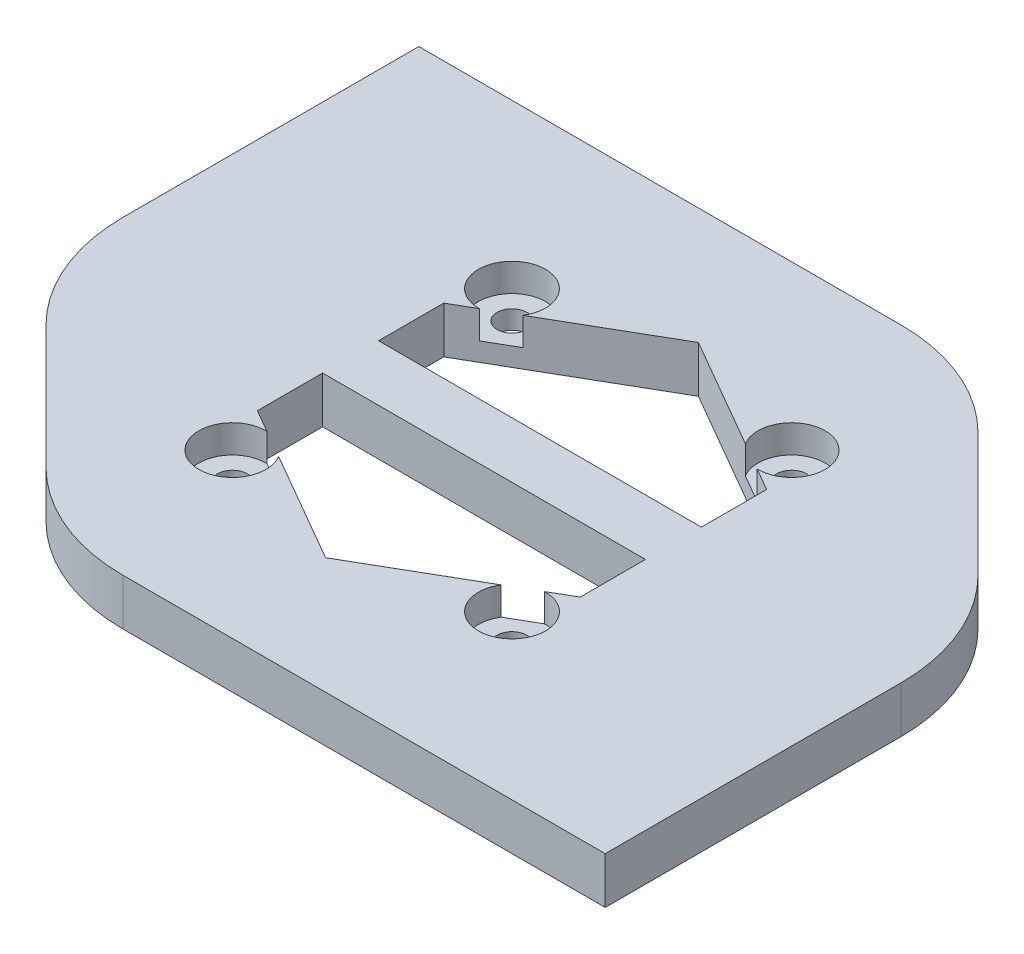
ISO-10303-21;
HEADER;
FILE_DESCRIPTION(('STEP AP214'),'2;1');
FILE_NAME('part.step','',(''),(''),'','','');
FILE_SCHEMA(('AUTOMOTIVE_DESIGN { 1 0 10303 214 1 1 1 1 }'));
ENDSEC;
DATA;
#1=APPLICATION_CONTEXT('core data for automotive mechanical design processes');
#2=APPLICATION_PROTOCOL_DEFINITION('international standard','automotive_design',2000,#1);
#3=PRODUCT_CONTEXT('',#1,'mechanical');
#4=PRODUCT('Part','Part','',(#3));
#5=PRODUCT_RELATED_PRODUCT_CATEGORY('part','',(#4));
#6=PRODUCT_DEFINITION_FORMATION('','',#4);
#7=PRODUCT_DEFINITION_CONTEXT('part definition',#1,'design');
#8=PRODUCT_DEFINITION('design','',#6,#7);
#9=PRODUCT_DEFINITION_SHAPE('','',#8);
#10=(LENGTH_UNIT() NAMED_UNIT(*) SI_UNIT(.MILLI.,.METRE.));
#11=(NAMED_UNIT(*) PLANE_ANGLE_UNIT() SI_UNIT($,.RADIAN.));
#12=(NAMED_UNIT(*) SI_UNIT($,.STERADIAN.) SOLID_ANGLE_UNIT());
#13=UNCERTAINTY_MEASURE_WITH_UNIT(LENGTH_MEASURE(1.E-05),#10,'distance_accuracy_value','');
#14=(GEOMETRIC_REPRESENTATION_CONTEXT(3) GLOBAL_UNCERTAINTY_ASSIGNED_CONTEXT((#13)) GLOBAL_UNIT_ASSIGNED_CONTEXT((#10,
#11,#12)) REPRESENTATION_CONTEXT('',''));
#15=CARTESIAN_POINT('',(0.,0.,0.));
#16=DIRECTION('',(0.,0.,1.));
#17=DIRECTION('',(1.,0.,0.));
#18=AXIS2_PLACEMENT_3D('',#15,#16,#17);
#19=CARTESIAN_POINT('',(42.5,5.,32.5));
#20=DIRECTION('',(-1.,0.,0.));
#21=DIRECTION('',(0.,0.,1.));
#22=AXIS2_PLACEMENT_3D('',#19,#20,#21);
#23=PLANE('',#22);
#24=DIRECTION('',(0.,0.,-1.));
#25=VECTOR('',#24,1.);
#26=CARTESIAN_POINT('',(42.5,0.,32.5));
#27=LINE('',#26,#25);
#28=CARTESIAN_POINT('',(42.5,0.,32.5));
#29=VERTEX_POINT('',#28);
#30=CARTESIAN_POINT('',(42.5,0.,0.784271247461894));
#31=VERTEX_POINT('',#30);
#32=EDGE_CURVE('E306',#29,#31,#27,.T.);
#33=ORIENTED_EDGE('',*,*,#32,.T.);
#34=DIRECTION('',(0.,1.,0.));
#35=VECTOR('',#34,1.);
#36=CARTESIAN_POINT('',(42.5,5.,0.784271247461894));
#37=LINE('',#36,#35);
#38=CARTESIAN_POINT('',(42.5,5.,0.784271247461894));
#39=VERTEX_POINT('',#38);
#40=EDGE_CURVE('E401',#31,#39,#37,.T.);
#41=ORIENTED_EDGE('',*,*,#40,.T.);
#42=DIRECTION('',(0.,0.,-1.));
#43=VECTOR('',#42,1.);
#44=CARTESIAN_POINT('',(42.5,5.,32.5));
#45=LINE('',#44,#43);
#46=CARTESIAN_POINT('',(42.5,5.,32.5));
#47=VERTEX_POINT('',#46);
#48=EDGE_CURVE('E294',#47,#39,#45,.T.);
#49=ORIENTED_EDGE('',*,*,#48,.F.);
#50=DIRECTION('',(0.,-1.,0.));
#51=VECTOR('',#50,1.);
#52=CARTESIAN_POINT('',(42.5,5.,32.5));
#53=LINE('',#52,#51);
#54=EDGE_CURVE('E305',#47,#29,#53,.T.);
#55=ORIENTED_EDGE('',*,*,#54,.T.);
#56=EDGE_LOOP('',(#33,#41,#49,#55));
#57=FACE_BOUND('',#56,.T.);
#58=ADVANCED_FACE('F37',(#57),#23,.F.);
#59=CARTESIAN_POINT('',(-42.5,5.,-32.5));
#60=DIRECTION('',(0.,0.,1.));
#61=DIRECTION('',(1.,0.,0.));
#62=AXIS2_PLACEMENT_3D('',#59,#60,#61);
#63=PLANE('',#62);
#64=DIRECTION('',(-1.,0.,0.));
#65=VECTOR('',#64,1.);
#66=CARTESIAN_POINT('',(-42.5,5.,-32.5));
#67=LINE('',#66,#65);
#68=CARTESIAN_POINT('',(9.21572875253809,5.,-32.5));
#69=VERTEX_POINT('',#68);
#70=CARTESIAN_POINT('',(-42.5,5.,-32.5));
#71=VERTEX_POINT('',#70);
#72=EDGE_CURVE('E297',#69,#71,#67,.T.);
#73=ORIENTED_EDGE('',*,*,#72,.F.);
#74=DIRECTION('',(0.,1.,0.));
#75=VECTOR('',#74,1.);
#76=CARTESIAN_POINT('',(9.21572875253809,0.,-32.5));
#77=LINE('',#76,#75);
#78=CARTESIAN_POINT('',(9.21572875253809,0.,-32.5));
#79=VERTEX_POINT('',#78);
#80=EDGE_CURVE('E11',#69,#79,#77,.F.);
#81=ORIENTED_EDGE('',*,*,#80,.T.);
#82=DIRECTION('',(-1.,0.,0.));
#83=VECTOR('',#82,1.);
#84=CARTESIAN_POINT('',(-42.5,0.,-32.5));
#85=LINE('',#84,#83);
#86=CARTESIAN_POINT('',(-42.5,0.,-32.5));
#87=VERTEX_POINT('',#86);
#88=EDGE_CURVE('E308',#79,#87,#85,.T.);
#89=ORIENTED_EDGE('',*,*,#88,.T.);
#90=DIRECTION('',(0.,-1.,0.));
#91=VECTOR('',#90,1.);
#92=CARTESIAN_POINT('',(-42.5,5.,-32.5));
#93=LINE('',#92,#91);
#94=EDGE_CURVE('E317',#71,#87,#93,.T.);
#95=ORIENTED_EDGE('',*,*,#94,.F.);
#96=EDGE_LOOP('',(#73,#81,#89,#95));
#97=FACE_BOUND('',#96,.T.);
#98=ADVANCED_FACE('F529',(#97),#63,.F.);
#99=CARTESIAN_POINT('',(0.,5.,0.));
#100=DIRECTION('',(0.,-1.,0.));
#101=DIRECTION('',(0.,0.,-1.));
#102=AXIS2_PLACEMENT_3D('',#99,#100,#101);
#103=PLANE('',#102);
#104=DIRECTION('',(0.866025403784439,0.,0.5));
#105=VECTOR('',#104,1.);
#106=CARTESIAN_POINT('',(-17.3205080756888,5.,10.));
#107=LINE('',#106,#105);
#108=CARTESIAN_POINT('',(-11.9372512876702,5.,13.1080247556794));
#109=VERTEX_POINT('',#108);
#110=CARTESIAN_POINT('',(0.,5.,20.));
#111=VERTEX_POINT('',#110);
#112=EDGE_CURVE('E259',#109,#111,#107,.T.);
#113=ORIENTED_EDGE('',*,*,#112,.F.);
#114=CARTESIAN_POINT('',(-15.,5.,15.));
#115=DIRECTION('',(0.,1.,0.));
#116=DIRECTION('',(0.,0.,1.));
#117=AXIS2_PLACEMENT_3D('',#114,#115,#116);
#118=CIRCLE('',#117,3.6);
#119=CARTESIAN_POINT('',(-14.892875731252,5.,11.401594187554));
#120=VERTEX_POINT('',#119);
#121=EDGE_CURVE('E450',#120,#109,#118,.T.);
#122=ORIENTED_EDGE('',*,*,#121,.F.);
#123=CARTESIAN_POINT('',(-17.3205080756888,5.,10.));
#124=VERTEX_POINT('',#123);
#125=EDGE_CURVE('E255',#124,#120,#107,.T.);
#126=ORIENTED_EDGE('',*,*,#125,.F.);
#127=DIRECTION('',(0.,0.,1.));
#128=VECTOR('',#127,1.);
#129=CARTESIAN_POINT('',(-17.3205080756888,5.,-10.));
#130=LINE('',#129,#128);
#131=CARTESIAN_POINT('',(-17.3205080756888,5.,3.));
#132=VERTEX_POINT('',#131);
#133=EDGE_CURVE('E272',#132,#124,#130,.T.);
#134=ORIENTED_EDGE('',*,*,#133,.F.);
#135=DIRECTION('',(1.,0.,0.));
#136=VECTOR('',#135,1.);
#137=CARTESIAN_POINT('',(-22.8414265511093,5.,3.));
#138=LINE('',#137,#136);
#139=CARTESIAN_POINT('',(17.3205080756888,5.,3.));
#140=VERTEX_POINT('',#139);
#141=EDGE_CURVE('E469',#132,#140,#138,.T.);
#142=ORIENTED_EDGE('',*,*,#141,.T.);
#143=DIRECTION('',(0.,0.,-1.));
#144=VECTOR('',#143,1.);
#145=CARTESIAN_POINT('',(17.3205080756888,5.,10.));
#146=LINE('',#145,#144);
#147=CARTESIAN_POINT('',(17.3205080756888,5.,10.));
#148=VERTEX_POINT('',#147);
#149=EDGE_CURVE('E253',#148,#140,#146,.T.);
#150=ORIENTED_EDGE('',*,*,#149,.F.);
#151=DIRECTION('',(0.866025403784439,0.,-0.5));
#152=VECTOR('',#151,1.);
#153=CARTESIAN_POINT('',(0.,5.,20.));
#154=LINE('',#153,#152);
#155=CARTESIAN_POINT('',(14.892875731252,5.,11.401594187554));
#156=VERTEX_POINT('',#155);
#157=EDGE_CURVE('E242',#156,#148,#154,.T.);
#158=ORIENTED_EDGE('',*,*,#157,.F.);
#159=CARTESIAN_POINT('',(15.,5.,15.));
#160=DIRECTION('',(0.,1.,0.));
#161=DIRECTION('',(0.,0.,1.));
#162=AXIS2_PLACEMENT_3D('',#159,#160,#161);
#163=CIRCLE('',#162,3.6);
#164=CARTESIAN_POINT('',(11.9372512876702,5.,13.1080247556794));
#165=VERTEX_POINT('',#164);
#166=EDGE_CURVE('E224',#165,#156,#163,.T.);
#167=ORIENTED_EDGE('',*,*,#166,.F.);
#168=EDGE_CURVE('E254',#111,#165,#154,.T.);
#169=ORIENTED_EDGE('',*,*,#168,.F.);
#170=EDGE_LOOP('',(#113,#122,#126,#134,#142,#150,#158,#167,#169));
#171=FACE_BOUND('',#170,.T.);
#172=DIRECTION('',(-0.866025403784439,0.,-0.5));
#173=VECTOR('',#172,1.);
#174=CARTESIAN_POINT('',(17.3205080756888,5.,-10.));
#175=LINE('',#174,#173);
#176=CARTESIAN_POINT('',(11.9372512876702,5.,-13.1080247556794));
#177=VERTEX_POINT('',#176);
#178=CARTESIAN_POINT('',(0.,5.,-20.));
#179=VERTEX_POINT('',#178);
#180=EDGE_CURVE('E264',#177,#179,#175,.T.);
#181=ORIENTED_EDGE('',*,*,#180,.F.);
#182=CARTESIAN_POINT('',(15.,5.,-15.));
#183=DIRECTION('',(0.,1.,0.));
#184=DIRECTION('',(0.,0.,1.));
#185=AXIS2_PLACEMENT_3D('',#182,#183,#184);
#186=CIRCLE('',#185,3.6);
#187=CARTESIAN_POINT('',(14.892875731252,5.,-11.401594187554));
#188=VERTEX_POINT('',#187);
#189=EDGE_CURVE('E445',#188,#177,#186,.T.);
#190=ORIENTED_EDGE('',*,*,#189,.F.);
#191=CARTESIAN_POINT('',(17.3205080756888,5.,-10.));
#192=VERTEX_POINT('',#191);
#193=EDGE_CURVE('E265',#192,#188,#175,.T.);
#194=ORIENTED_EDGE('',*,*,#193,.F.);
#195=CARTESIAN_POINT('',(17.3205080756888,5.,-3.));
#196=VERTEX_POINT('',#195);
#197=EDGE_CURVE('E257',#196,#192,#146,.T.);
#198=ORIENTED_EDGE('',*,*,#197,.F.);
#199=DIRECTION('',(-1.,0.,0.));
#200=VECTOR('',#199,1.);
#201=CARTESIAN_POINT('',(-22.8414265511093,5.,-3.));
#202=LINE('',#201,#200);
#203=CARTESIAN_POINT('',(-17.3205080756888,5.,-3.));
#204=VERTEX_POINT('',#203);
#205=EDGE_CURVE('E468',#196,#204,#202,.T.);
#206=ORIENTED_EDGE('',*,*,#205,.T.);
#207=CARTESIAN_POINT('',(-17.3205080756888,5.,-10.));
#208=VERTEX_POINT('',#207);
#209=EDGE_CURVE('E273',#208,#204,#130,.T.);
#210=ORIENTED_EDGE('',*,*,#209,.F.);
#211=DIRECTION('',(-0.866025403784439,0.,0.5));
#212=VECTOR('',#211,1.);
#213=CARTESIAN_POINT('',(0.,5.,-20.));
#214=LINE('',#213,#212);
#215=CARTESIAN_POINT('',(-14.892875731252,5.,-11.401594187554));
#216=VERTEX_POINT('',#215);
#217=EDGE_CURVE('E268',#216,#208,#214,.T.);
#218=ORIENTED_EDGE('',*,*,#217,.F.);
#219=CARTESIAN_POINT('',(-15.,5.,-15.));
#220=DIRECTION('',(0.,1.,0.));
#221=DIRECTION('',(0.,0.,1.));
#222=AXIS2_PLACEMENT_3D('',#219,#220,#221);
#223=CIRCLE('',#222,3.6);
#224=CARTESIAN_POINT('',(-11.9372512876702,5.,-13.1080247556794));
#225=VERTEX_POINT('',#224);
#226=EDGE_CURVE('E447',#225,#216,#223,.T.);
#227=ORIENTED_EDGE('',*,*,#226,.F.);
#228=EDGE_CURVE('E269',#179,#225,#214,.T.);
#229=ORIENTED_EDGE('',*,*,#228,.F.);
#230=EDGE_LOOP('',(#181,#190,#194,#198,#206,#210,#218,#227,#229));
#231=FACE_BOUND('',#230,.T.);
#232=DIRECTION('',(0.,0.,1.));
#233=VECTOR('',#232,1.);
#234=CARTESIAN_POINT('',(-42.5,5.,32.5));
#235=LINE('',#234,#233);
#236=CARTESIAN_POINT('',(-42.5,5.,-0.784271247461908));
#237=VERTEX_POINT('',#236);
#238=EDGE_CURVE('E300',#71,#237,#235,.T.);
#239=ORIENTED_EDGE('',*,*,#238,.T.);
#240=CARTESIAN_POINT('',(-22.5,5.,-0.784271247461908));
#241=DIRECTION('',(0.,-1.,0.));
#242=DIRECTION('',(0.,0.,-1.));
#243=AXIS2_PLACEMENT_3D('',#240,#241,#242);
#244=CIRCLE('',#243,20.);
#245=CARTESIAN_POINT('',(-36.642135623731,5.,13.357864376269));
#246=VERTEX_POINT('',#245);
#247=EDGE_CURVE('E386',#237,#246,#244,.F.);
#248=ORIENTED_EDGE('',*,*,#247,.T.);
#249=DIRECTION('',(0.707106781186548,0.,0.707106781186548));
#250=VECTOR('',#249,1.);
#251=CARTESIAN_POINT('',(-25.,5.,25.));
#252=LINE('',#251,#250);
#253=CARTESIAN_POINT('',(-23.357864376269,5.,26.642135623731));
#254=VERTEX_POINT('',#253);
#255=EDGE_CURVE('E420',#246,#254,#252,.T.);
#256=ORIENTED_EDGE('',*,*,#255,.T.);
#257=CARTESIAN_POINT('',(-9.2157287525381,5.,12.5));
#258=DIRECTION('',(0.,-1.,0.));
#259=DIRECTION('',(0.,0.,-1.));
#260=AXIS2_PLACEMENT_3D('',#257,#258,#259);
#261=CIRCLE('',#260,20.);
#262=CARTESIAN_POINT('',(-9.2157287525381,5.,32.5));
#263=VERTEX_POINT('',#262);
#264=EDGE_CURVE('E384',#254,#263,#261,.F.);
#265=ORIENTED_EDGE('',*,*,#264,.T.);
#266=DIRECTION('',(1.,0.,0.));
#267=VECTOR('',#266,1.);
#268=CARTESIAN_POINT('',(-42.5,5.,32.5));
#269=LINE('',#268,#267);
#270=EDGE_CURVE('E303',#263,#47,#269,.T.);
#271=ORIENTED_EDGE('',*,*,#270,.T.);
#272=ORIENTED_EDGE('',*,*,#48,.T.);
#273=CARTESIAN_POINT('',(22.5,5.,0.784271247461894));
#274=DIRECTION('',(0.,-1.,0.));
#275=DIRECTION('',(0.,0.,-1.));
#276=AXIS2_PLACEMENT_3D('',#273,#274,#275);
#277=CIRCLE('',#276,20.);
#278=CARTESIAN_POINT('',(36.642135623731,5.,-13.357864376269));
#279=VERTEX_POINT('',#278);
#280=EDGE_CURVE('E382',#39,#279,#277,.F.);
#281=ORIENTED_EDGE('',*,*,#280,.T.);
#282=DIRECTION('',(0.707106781186548,0.,0.707106781186548));
#283=VECTOR('',#282,1.);
#284=CARTESIAN_POINT('',(25.,5.,-25.));
#285=LINE('',#284,#283);
#286=CARTESIAN_POINT('',(23.357864376269,5.,-26.642135623731));
#287=VERTEX_POINT('',#286);
#288=EDGE_CURVE('E414',#287,#279,#285,.T.);
#289=ORIENTED_EDGE('',*,*,#288,.F.);
#290=CARTESIAN_POINT('',(9.21572875253809,5.,-12.5));
#291=DIRECTION('',(0.,-1.,0.));
#292=DIRECTION('',(0.,0.,-1.));
#293=AXIS2_PLACEMENT_3D('',#290,#291,#292);
#294=CIRCLE('',#293,20.);
#295=EDGE_CURVE('E380',#287,#69,#294,.F.);
#296=ORIENTED_EDGE('',*,*,#295,.T.);
#297=ORIENTED_EDGE('',*,*,#72,.T.);
#298=EDGE_LOOP('',(#239,#248,#256,#265,#271,#272,#281,#289,#296,#297));
#299=FACE_BOUND('',#298,.T.);
#300=ADVANCED_FACE('F249',(#171,#231,#299),#103,.F.);
#301=CARTESIAN_POINT('',(0.,0.,0.));
#302=DIRECTION('',(0.,-1.,0.));
#303=DIRECTION('',(0.,0.,-1.));
#304=AXIS2_PLACEMENT_3D('',#301,#302,#303);
#305=PLANE('',#304);
#306=DIRECTION('',(0.,0.,-1.));
#307=VECTOR('',#306,1.);
#308=CARTESIAN_POINT('',(-17.3205080756888,0.,0.));
#309=LINE('',#308,#307);
#310=CARTESIAN_POINT('',(-17.3205080756888,0.,-3.));
#311=VERTEX_POINT('',#310);
#312=CARTESIAN_POINT('',(-17.3205080756888,0.,-10.));
#313=VERTEX_POINT('',#312);
#314=EDGE_CURVE('E340',#311,#313,#309,.T.);
#315=ORIENTED_EDGE('',*,*,#314,.F.);
#316=DIRECTION('',(-1.,0.,0.));
#317=VECTOR('',#316,1.);
#318=CARTESIAN_POINT('',(-22.8414265511093,0.,-3.));
#319=LINE('',#318,#317);
#320=CARTESIAN_POINT('',(17.3205080756888,0.,-3.));
#321=VERTEX_POINT('',#320);
#322=EDGE_CURVE('E471',#321,#311,#319,.T.);
#323=ORIENTED_EDGE('',*,*,#322,.F.);
#324=DIRECTION('',(0.,0.,1.));
#325=VECTOR('',#324,1.);
#326=CARTESIAN_POINT('',(17.3205080756888,0.,0.));
#327=LINE('',#326,#325);
#328=CARTESIAN_POINT('',(17.3205080756888,0.,-10.));
#329=VERTEX_POINT('',#328);
#330=EDGE_CURVE('E333',#329,#321,#327,.T.);
#331=ORIENTED_EDGE('',*,*,#330,.F.);
#332=DIRECTION('',(0.866025403784439,0.,0.5));
#333=VECTOR('',#332,1.);
#334=CARTESIAN_POINT('',(8.66025403784439,0.,-15.));
#335=LINE('',#334,#333);
#336=CARTESIAN_POINT('',(0.,0.,-20.));
#337=VERTEX_POINT('',#336);
#338=EDGE_CURVE('E336',#337,#329,#335,.T.);
#339=ORIENTED_EDGE('',*,*,#338,.F.);
#340=DIRECTION('',(0.866025403784439,0.,-0.5));
#341=VECTOR('',#340,1.);
#342=CARTESIAN_POINT('',(-8.66025403784439,0.,-15.));
#343=LINE('',#342,#341);
#344=EDGE_CURVE('E338',#313,#337,#343,.T.);
#345=ORIENTED_EDGE('',*,*,#344,.F.);
#346=EDGE_LOOP('',(#315,#323,#331,#339,#345));
#347=FACE_BOUND('',#346,.T.);
#348=CARTESIAN_POINT('',(17.3205080756888,0.,3.));
#349=VERTEX_POINT('',#348);
#350=CARTESIAN_POINT('',(17.3205080756888,0.,10.));
#351=VERTEX_POINT('',#350);
#352=EDGE_CURVE('E332',#349,#351,#327,.T.);
#353=ORIENTED_EDGE('',*,*,#352,.F.);
#354=DIRECTION('',(1.,0.,0.));
#355=VECTOR('',#354,1.);
#356=CARTESIAN_POINT('',(-22.8414265511093,0.,3.));
#357=LINE('',#356,#355);
#358=CARTESIAN_POINT('',(-17.3205080756888,0.,3.));
#359=VERTEX_POINT('',#358);
#360=EDGE_CURVE('E475',#359,#349,#357,.T.);
#361=ORIENTED_EDGE('',*,*,#360,.F.);
#362=CARTESIAN_POINT('',(-17.3205080756888,0.,10.));
#363=VERTEX_POINT('',#362);
#364=EDGE_CURVE('E341',#363,#359,#309,.T.);
#365=ORIENTED_EDGE('',*,*,#364,.F.);
#366=DIRECTION('',(-0.866025403784439,0.,-0.5));
#367=VECTOR('',#366,1.);
#368=CARTESIAN_POINT('',(-8.66025403784439,0.,15.));
#369=LINE('',#368,#367);
#370=CARTESIAN_POINT('',(0.,0.,20.));
#371=VERTEX_POINT('',#370);
#372=EDGE_CURVE('E344',#371,#363,#369,.T.);
#373=ORIENTED_EDGE('',*,*,#372,.F.);
#374=DIRECTION('',(-0.866025403784439,0.,0.5));
#375=VECTOR('',#374,1.);
#376=CARTESIAN_POINT('',(8.66025403784439,0.,15.));
#377=LINE('',#376,#375);
#378=EDGE_CURVE('E320',#351,#371,#377,.T.);
#379=ORIENTED_EDGE('',*,*,#378,.F.);
#380=EDGE_LOOP('',(#353,#361,#365,#373,#379));
#381=FACE_BOUND('',#380,.T.);
#382=CARTESIAN_POINT('',(15.,0.,-15.));
#383=DIRECTION('',(0.,-1.,0.));
#384=DIRECTION('',(0.,0.,-1.));
#385=AXIS2_PLACEMENT_3D('',#382,#383,#384);
#386=CIRCLE('',#385,1.6);
#387=CARTESIAN_POINT('',(15.,0.,-16.6));
#388=VERTEX_POINT('',#387);
#389=EDGE_CURVE('E309',#388,#388,#386,.T.);
#390=ORIENTED_EDGE('',*,*,#389,.F.);
#391=EDGE_LOOP('',(#390));
#392=FACE_BOUND('',#391,.T.);
#393=CARTESIAN_POINT('',(-15.,0.,15.));
#394=DIRECTION('',(0.,-1.,0.));
#395=DIRECTION('',(0.,0.,-1.));
#396=AXIS2_PLACEMENT_3D('',#393,#394,#395);
#397=CIRCLE('',#396,1.6);
#398=CARTESIAN_POINT('',(-15.,0.,13.4));
#399=VERTEX_POINT('',#398);
#400=EDGE_CURVE('E326',#399,#399,#397,.T.);
#401=ORIENTED_EDGE('',*,*,#400,.F.);
#402=EDGE_LOOP('',(#401));
#403=FACE_BOUND('',#402,.T.);
#404=CARTESIAN_POINT('',(15.,0.,15.));
#405=DIRECTION('',(0.,-1.,0.));
#406=DIRECTION('',(0.,0.,-1.));
#407=AXIS2_PLACEMENT_3D('',#404,#405,#406);
#408=CIRCLE('',#407,1.6);
#409=CARTESIAN_POINT('',(15.,0.,13.4));
#410=VERTEX_POINT('',#409);
#411=EDGE_CURVE('E323',#410,#410,#408,.T.);
#412=ORIENTED_EDGE('',*,*,#411,.F.);
#413=EDGE_LOOP('',(#412));
#414=FACE_BOUND('',#413,.T.);
#415=CARTESIAN_POINT('',(-15.,0.,-15.));
#416=DIRECTION('',(0.,-1.,0.));
#417=DIRECTION('',(0.,0.,-1.));
#418=AXIS2_PLACEMENT_3D('',#415,#416,#417);
#419=CIRCLE('',#418,1.6);
#420=CARTESIAN_POINT('',(-15.,0.,-16.6));
#421=VERTEX_POINT('',#420);
#422=EDGE_CURVE('E280',#421,#421,#419,.T.);
#423=ORIENTED_EDGE('',*,*,#422,.F.);
#424=EDGE_LOOP('',(#423));
#425=FACE_BOUND('',#424,.T.);
#426=DIRECTION('',(-0.707106781186548,0.,-0.707106781186548));
#427=VECTOR('',#426,1.);
#428=CARTESIAN_POINT('',(-25.,0.,25.));
#429=LINE('',#428,#427);
#430=CARTESIAN_POINT('',(-23.357864376269,0.,26.642135623731));
#431=VERTEX_POINT('',#430);
#432=CARTESIAN_POINT('',(-36.642135623731,0.,13.357864376269));
#433=VERTEX_POINT('',#432);
#434=EDGE_CURVE('E421',#431,#433,#429,.T.);
#435=ORIENTED_EDGE('',*,*,#434,.T.);
#436=CARTESIAN_POINT('',(-22.5,0.,-0.784271247461908));
#437=DIRECTION('',(0.,-1.,0.));
#438=DIRECTION('',(0.,0.,-1.));
#439=AXIS2_PLACEMENT_3D('',#436,#437,#438);
#440=CIRCLE('',#439,20.);
#441=CARTESIAN_POINT('',(-42.5,0.,-0.784271247461908));
#442=VERTEX_POINT('',#441);
#443=EDGE_CURVE('E398',#433,#442,#440,.T.);
#444=ORIENTED_EDGE('',*,*,#443,.T.);
#445=DIRECTION('',(0.,0.,1.));
#446=VECTOR('',#445,1.);
#447=CARTESIAN_POINT('',(-42.5,0.,32.5));
#448=LINE('',#447,#446);
#449=EDGE_CURVE('E311',#87,#442,#448,.T.);
#450=ORIENTED_EDGE('',*,*,#449,.F.);
#451=ORIENTED_EDGE('',*,*,#88,.F.);
#452=CARTESIAN_POINT('',(9.21572875253809,0.,-12.5));
#453=DIRECTION('',(0.,-1.,0.));
#454=DIRECTION('',(0.,0.,-1.));
#455=AXIS2_PLACEMENT_3D('',#452,#453,#454);
#456=CIRCLE('',#455,20.);
#457=CARTESIAN_POINT('',(23.357864376269,0.,-26.642135623731));
#458=VERTEX_POINT('',#457);
#459=EDGE_CURVE('E393',#79,#458,#456,.T.);
#460=ORIENTED_EDGE('',*,*,#459,.T.);
#461=DIRECTION('',(-0.707106781186548,0.,-0.707106781186548));
#462=VECTOR('',#461,1.);
#463=CARTESIAN_POINT('',(25.,0.,-25.));
#464=LINE('',#463,#462);
#465=CARTESIAN_POINT('',(36.642135623731,0.,-13.357864376269));
#466=VERTEX_POINT('',#465);
#467=EDGE_CURVE('E411',#466,#458,#464,.T.);
#468=ORIENTED_EDGE('',*,*,#467,.F.);
#469=CARTESIAN_POINT('',(22.5,0.,0.784271247461894));
#470=DIRECTION('',(0.,-1.,0.));
#471=DIRECTION('',(0.,0.,-1.));
#472=AXIS2_PLACEMENT_3D('',#469,#470,#471);
#473=CIRCLE('',#472,20.);
#474=EDGE_CURVE('E60',#466,#31,#473,.T.);
#475=ORIENTED_EDGE('',*,*,#474,.T.);
#476=ORIENTED_EDGE('',*,*,#32,.F.);
#477=DIRECTION('',(1.,0.,0.));
#478=VECTOR('',#477,1.);
#479=CARTESIAN_POINT('',(-42.5,0.,32.5));
#480=LINE('',#479,#478);
#481=CARTESIAN_POINT('',(-9.2157287525381,0.,32.5));
#482=VERTEX_POINT('',#481);
#483=EDGE_CURVE('E298',#482,#29,#480,.T.);
#484=ORIENTED_EDGE('',*,*,#483,.F.);
#485=CARTESIAN_POINT('',(-9.2157287525381,0.,12.5));
#486=DIRECTION('',(0.,-1.,0.));
#487=DIRECTION('',(0.,0.,-1.));
#488=AXIS2_PLACEMENT_3D('',#485,#486,#487);
#489=CIRCLE('',#488,20.);
#490=EDGE_CURVE('E396',#482,#431,#489,.T.);
#491=ORIENTED_EDGE('',*,*,#490,.T.);
#492=EDGE_LOOP('',(#435,#444,#450,#451,#460,#468,#475,#476,#484,#491));
#493=FACE_BOUND('',#492,.T.);
#494=ADVANCED_FACE('F417',(#347,#381,#392,#403,#414,#425,#493),#305,.T.);
#495=CARTESIAN_POINT('',(-15.,-41.,-15.));
#496=DIRECTION('',(0.,1.,0.));
#497=DIRECTION('',(0.,0.,1.));
#498=AXIS2_PLACEMENT_3D('',#495,#496,#497);
#499=CYLINDRICAL_SURFACE('',#498,1.6);
#500=ORIENTED_EDGE('',*,*,#422,.T.);
#501=EDGE_LOOP('',(#500));
#502=FACE_BOUND('',#501,.T.);
#503=CARTESIAN_POINT('',(-15.,2.,-15.));
#504=DIRECTION('',(0.,1.,0.));
#505=DIRECTION('',(0.,0.,1.));
#506=AXIS2_PLACEMENT_3D('',#503,#504,#505);
#507=CIRCLE('',#506,1.6);
#508=CARTESIAN_POINT('',(-15.,2.,-13.4));
#509=VERTEX_POINT('',#508);
#510=EDGE_CURVE('E462',#509,#509,#507,.F.);
#511=ORIENTED_EDGE('',*,*,#510,.F.);
#512=EDGE_LOOP('',(#511));
#513=FACE_BOUND('',#512,.T.);
#514=ADVANCED_FACE('F524',(#502,#513),#499,.F.);
#515=CARTESIAN_POINT('',(15.,-41.,15.));
#516=DIRECTION('',(0.,1.,0.));
#517=DIRECTION('',(0.,0.,1.));
#518=AXIS2_PLACEMENT_3D('',#515,#516,#517);
#519=CYLINDRICAL_SURFACE('',#518,1.6);
#520=ORIENTED_EDGE('',*,*,#411,.T.);
#521=EDGE_LOOP('',(#520));
#522=FACE_BOUND('',#521,.T.);
#523=CARTESIAN_POINT('',(15.,2.,15.));
#524=DIRECTION('',(0.,1.,0.));
#525=DIRECTION('',(0.,0.,1.));
#526=AXIS2_PLACEMENT_3D('',#523,#524,#525);
#527=CIRCLE('',#526,1.6);
#528=CARTESIAN_POINT('',(15.,2.,16.6));
#529=VERTEX_POINT('',#528);
#530=EDGE_CURVE('E455',#529,#529,#527,.F.);
#531=ORIENTED_EDGE('',*,*,#530,.F.);
#532=EDGE_LOOP('',(#531));
#533=FACE_BOUND('',#532,.T.);
#534=ADVANCED_FACE('F514',(#522,#533),#519,.F.);
#535=CARTESIAN_POINT('',(-15.,-41.,15.));
#536=DIRECTION('',(0.,1.,0.));
#537=DIRECTION('',(0.,0.,1.));
#538=AXIS2_PLACEMENT_3D('',#535,#536,#537);
#539=CYLINDRICAL_SURFACE('',#538,1.6);
#540=ORIENTED_EDGE('',*,*,#400,.T.);
#541=EDGE_LOOP('',(#540));
#542=FACE_BOUND('',#541,.T.);
#543=CARTESIAN_POINT('',(-15.,2.,15.));
#544=DIRECTION('',(0.,1.,0.));
#545=DIRECTION('',(0.,0.,1.));
#546=AXIS2_PLACEMENT_3D('',#543,#544,#545);
#547=CIRCLE('',#546,1.6);
#548=CARTESIAN_POINT('',(-15.,2.,16.6));
#549=VERTEX_POINT('',#548);
#550=EDGE_CURVE('E465',#549,#549,#547,.F.);
#551=ORIENTED_EDGE('',*,*,#550,.F.);
#552=EDGE_LOOP('',(#551));
#553=FACE_BOUND('',#552,.T.);
#554=ADVANCED_FACE('F511',(#542,#553),#539,.F.);
#555=CARTESIAN_POINT('',(15.,-41.,-15.));
#556=DIRECTION('',(0.,1.,0.));
#557=DIRECTION('',(0.,0.,1.));
#558=AXIS2_PLACEMENT_3D('',#555,#556,#557);
#559=CYLINDRICAL_SURFACE('',#558,1.6);
#560=ORIENTED_EDGE('',*,*,#389,.T.);
#561=EDGE_LOOP('',(#560));
#562=FACE_BOUND('',#561,.T.);
#563=CARTESIAN_POINT('',(15.,2.,-15.));
#564=DIRECTION('',(0.,1.,0.));
#565=DIRECTION('',(0.,0.,1.));
#566=AXIS2_PLACEMENT_3D('',#563,#564,#565);
#567=CIRCLE('',#566,1.6);
#568=CARTESIAN_POINT('',(15.,2.,-13.4));
#569=VERTEX_POINT('',#568);
#570=EDGE_CURVE('E459',#569,#569,#567,.F.);
#571=ORIENTED_EDGE('',*,*,#570,.F.);
#572=EDGE_LOOP('',(#571));
#573=FACE_BOUND('',#572,.T.);
#574=ADVANCED_FACE('F513',(#562,#573),#559,.F.);
#575=CARTESIAN_POINT('',(-17.3205080756888,-41.,-10.));
#576=DIRECTION('',(-1.,0.,0.));
#577=DIRECTION('',(0.,0.,1.));
#578=AXIS2_PLACEMENT_3D('',#575,#576,#577);
#579=PLANE('',#578);
#580=ORIENTED_EDGE('',*,*,#209,.T.);
#581=DIRECTION('',(0.,-1.,0.));
#582=VECTOR('',#581,1.);
#583=CARTESIAN_POINT('',(-17.3205080756888,-41.,-3.));
#584=LINE('',#583,#582);
#585=EDGE_CURVE('E479',#204,#311,#584,.T.);
#586=ORIENTED_EDGE('',*,*,#585,.T.);
#587=ORIENTED_EDGE('',*,*,#314,.T.);
#588=DIRECTION('',(0.,1.,0.));
#589=VECTOR('',#588,1.);
#590=CARTESIAN_POINT('',(-17.3205080756888,-41.,-10.));
#591=LINE('',#590,#589);
#592=EDGE_CURVE('E281',#313,#208,#591,.T.);
#593=ORIENTED_EDGE('',*,*,#592,.T.);
#594=EDGE_LOOP('',(#580,#586,#587,#593));
#595=FACE_BOUND('',#594,.T.);
#596=ADVANCED_FACE('F521',(#595),#579,.F.);
#597=CARTESIAN_POINT('',(17.3205080756888,-41.,10.));
#598=DIRECTION('',(1.,0.,0.));
#599=DIRECTION('',(0.,0.,-1.));
#600=AXIS2_PLACEMENT_3D('',#597,#598,#599);
#601=PLANE('',#600);
#602=ORIENTED_EDGE('',*,*,#330,.T.);
#603=DIRECTION('',(0.,1.,0.));
#604=VECTOR('',#603,1.);
#605=CARTESIAN_POINT('',(17.3205080756888,-41.,-3.));
#606=LINE('',#605,#604);
#607=EDGE_CURVE('E349',#321,#196,#606,.T.);
#608=ORIENTED_EDGE('',*,*,#607,.T.);
#609=ORIENTED_EDGE('',*,*,#197,.T.);
#610=DIRECTION('',(0.,1.,0.));
#611=VECTOR('',#610,1.);
#612=CARTESIAN_POINT('',(17.3205080756888,-41.,-10.));
#613=LINE('',#612,#611);
#614=EDGE_CURVE('E287',#329,#192,#613,.T.);
#615=ORIENTED_EDGE('',*,*,#614,.F.);
#616=EDGE_LOOP('',(#602,#608,#609,#615));
#617=FACE_BOUND('',#616,.T.);
#618=ADVANCED_FACE('F560',(#617),#601,.F.);
#619=CARTESIAN_POINT('',(-42.5,5.,32.5));
#620=DIRECTION('',(1.,0.,0.));
#621=DIRECTION('',(0.,0.,-1.));
#622=AXIS2_PLACEMENT_3D('',#619,#620,#621);
#623=PLANE('',#622);
#624=ORIENTED_EDGE('',*,*,#449,.T.);
#625=DIRECTION('',(0.,1.,0.));
#626=VECTOR('',#625,1.);
#627=CARTESIAN_POINT('',(-42.5,5.,-0.784271247461908));
#628=LINE('',#627,#626);
#629=EDGE_CURVE('E377',#442,#237,#628,.T.);
#630=ORIENTED_EDGE('',*,*,#629,.T.);
#631=ORIENTED_EDGE('',*,*,#238,.F.);
#632=ORIENTED_EDGE('',*,*,#94,.T.);
#633=EDGE_LOOP('',(#624,#630,#631,#632));
#634=FACE_BOUND('',#633,.T.);
#635=ADVANCED_FACE('F556',(#634),#623,.F.);
#636=CARTESIAN_POINT('',(-42.5,5.,32.5));
#637=DIRECTION('',(0.,0.,-1.));
#638=DIRECTION('',(-1.,0.,0.));
#639=AXIS2_PLACEMENT_3D('',#636,#637,#638);
#640=PLANE('',#639);
#641=ORIENTED_EDGE('',*,*,#270,.F.);
#642=DIRECTION('',(0.,1.,0.));
#643=VECTOR('',#642,1.);
#644=CARTESIAN_POINT('',(-9.2157287525381,5.,32.5));
#645=LINE('',#644,#643);
#646=EDGE_CURVE('E52',#263,#482,#645,.F.);
#647=ORIENTED_EDGE('',*,*,#646,.T.);
#648=ORIENTED_EDGE('',*,*,#483,.T.);
#649=ORIENTED_EDGE('',*,*,#54,.F.);
#650=EDGE_LOOP('',(#641,#647,#648,#649));
#651=FACE_BOUND('',#650,.T.);
#652=ADVANCED_FACE('F430',(#651),#640,.F.);
#653=CARTESIAN_POINT('',(-17.3205080756888,-41.,10.));
#654=DIRECTION('',(-0.5,0.,0.866025403784439));
#655=DIRECTION('',(0.866025403784439,0.,0.5));
#656=AXIS2_PLACEMENT_3D('',#653,#654,#655);
#657=PLANE('',#656);
#658=DIRECTION('',(-0.866025403784439,0.,-0.5));
#659=VECTOR('',#658,1.);
#660=CARTESIAN_POINT('',(-17.3205080756888,2.,10.));
#661=LINE('',#660,#659);
#662=CARTESIAN_POINT('',(-11.9372512876702,2.,13.1080247556794));
#663=VERTEX_POINT('',#662);
#664=CARTESIAN_POINT('',(-14.892875731252,2.,11.401594187554));
#665=VERTEX_POINT('',#664);
#666=EDGE_CURVE('E369',#663,#665,#661,.T.);
#667=ORIENTED_EDGE('',*,*,#666,.F.);
#668=DIRECTION('',(0.,1.,0.));
#669=VECTOR('',#668,1.);
#670=CARTESIAN_POINT('',(-11.9372512876702,2.,13.1080247556794));
#671=LINE('',#670,#669);
#672=EDGE_CURVE('E374',#663,#109,#671,.T.);
#673=ORIENTED_EDGE('',*,*,#672,.T.);
#674=ORIENTED_EDGE('',*,*,#112,.T.);
#675=DIRECTION('',(0.,1.,0.));
#676=VECTOR('',#675,1.);
#677=CARTESIAN_POINT('',(0.,-41.,20.));
#678=LINE('',#677,#676);
#679=EDGE_CURVE('E276',#371,#111,#678,.T.);
#680=ORIENTED_EDGE('',*,*,#679,.F.);
#681=ORIENTED_EDGE('',*,*,#372,.T.);
#682=DIRECTION('',(0.,1.,0.));
#683=VECTOR('',#682,1.);
#684=CARTESIAN_POINT('',(-17.3205080756888,-41.,10.));
#685=LINE('',#684,#683);
#686=EDGE_CURVE('E277',#363,#124,#685,.T.);
#687=ORIENTED_EDGE('',*,*,#686,.T.);
#688=ORIENTED_EDGE('',*,*,#125,.T.);
#689=DIRECTION('',(0.,1.,0.));
#690=VECTOR('',#689,1.);
#691=CARTESIAN_POINT('',(-14.892875731252,2.,11.401594187554));
#692=LINE('',#691,#690);
#693=EDGE_CURVE('E371',#120,#665,#692,.F.);
#694=ORIENTED_EDGE('',*,*,#693,.T.);
#695=EDGE_LOOP('',(#667,#673,#674,#680,#681,#687,#688,#694));
#696=FACE_BOUND('',#695,.T.);
#697=ADVANCED_FACE('F486',(#696),#657,.F.);
#698=ORIENTED_EDGE('',*,*,#364,.T.);
#699=DIRECTION('',(0.,1.,0.));
#700=VECTOR('',#699,1.);
#701=CARTESIAN_POINT('',(-17.3205080756888,-41.,3.));
#702=LINE('',#701,#700);
#703=EDGE_CURVE('E477',#359,#132,#702,.T.);
#704=ORIENTED_EDGE('',*,*,#703,.T.);
#705=ORIENTED_EDGE('',*,*,#133,.T.);
#706=ORIENTED_EDGE('',*,*,#686,.F.);
#707=EDGE_LOOP('',(#698,#704,#705,#706));
#708=FACE_BOUND('',#707,.T.);
#709=ADVANCED_FACE('F499',(#708),#579,.F.);
#710=CARTESIAN_POINT('',(0.,-41.,-20.));
#711=DIRECTION('',(-0.5,0.,-0.866025403784439));
#712=DIRECTION('',(-0.866025403784439,0.,0.5));
#713=AXIS2_PLACEMENT_3D('',#710,#711,#712);
#714=PLANE('',#713);
#715=DIRECTION('',(0.866025403784439,0.,-0.5));
#716=VECTOR('',#715,1.);
#717=CARTESIAN_POINT('',(0.,2.,-20.));
#718=LINE('',#717,#716);
#719=CARTESIAN_POINT('',(-14.892875731252,2.,-11.401594187554));
#720=VERTEX_POINT('',#719);
#721=CARTESIAN_POINT('',(-11.9372512876702,2.,-13.1080247556794));
#722=VERTEX_POINT('',#721);
#723=EDGE_CURVE('E361',#720,#722,#718,.T.);
#724=ORIENTED_EDGE('',*,*,#723,.F.);
#725=DIRECTION('',(0.,1.,0.));
#726=VECTOR('',#725,1.);
#727=CARTESIAN_POINT('',(-14.892875731252,2.,-11.401594187554));
#728=LINE('',#727,#726);
#729=EDGE_CURVE('E366',#720,#216,#728,.T.);
#730=ORIENTED_EDGE('',*,*,#729,.T.);
#731=ORIENTED_EDGE('',*,*,#217,.T.);
#732=ORIENTED_EDGE('',*,*,#592,.F.);
#733=ORIENTED_EDGE('',*,*,#344,.T.);
#734=DIRECTION('',(0.,1.,0.));
#735=VECTOR('',#734,1.);
#736=CARTESIAN_POINT('',(0.,-41.,-20.));
#737=LINE('',#736,#735);
#738=EDGE_CURVE('E284',#337,#179,#737,.T.);
#739=ORIENTED_EDGE('',*,*,#738,.T.);
#740=ORIENTED_EDGE('',*,*,#228,.T.);
#741=DIRECTION('',(0.,1.,0.));
#742=VECTOR('',#741,1.);
#743=CARTESIAN_POINT('',(-11.9372512876702,2.,-13.1080247556794));
#744=LINE('',#743,#742);
#745=EDGE_CURVE('E363',#225,#722,#744,.F.);
#746=ORIENTED_EDGE('',*,*,#745,.T.);
#747=EDGE_LOOP('',(#724,#730,#731,#732,#733,#739,#740,#746));
#748=FACE_BOUND('',#747,.T.);
#749=ADVANCED_FACE('F606',(#748),#714,.F.);
#750=CARTESIAN_POINT('',(17.3205080756888,-41.,-10.));
#751=DIRECTION('',(0.5,0.,-0.866025403784439));
#752=DIRECTION('',(-0.866025403784439,0.,-0.5));
#753=AXIS2_PLACEMENT_3D('',#750,#751,#752);
#754=PLANE('',#753);
#755=DIRECTION('',(0.866025403784439,0.,0.5));
#756=VECTOR('',#755,1.);
#757=CARTESIAN_POINT('',(17.3205080756888,2.,-10.));
#758=LINE('',#757,#756);
#759=CARTESIAN_POINT('',(11.9372512876702,2.,-13.1080247556794));
#760=VERTEX_POINT('',#759);
#761=CARTESIAN_POINT('',(14.892875731252,2.,-11.401594187554));
#762=VERTEX_POINT('',#761);
#763=EDGE_CURVE('E245',#760,#762,#758,.T.);
#764=ORIENTED_EDGE('',*,*,#763,.F.);
#765=DIRECTION('',(0.,1.,0.));
#766=VECTOR('',#765,1.);
#767=CARTESIAN_POINT('',(11.9372512876702,2.,-13.1080247556794));
#768=LINE('',#767,#766);
#769=EDGE_CURVE('E358',#760,#177,#768,.T.);
#770=ORIENTED_EDGE('',*,*,#769,.T.);
#771=ORIENTED_EDGE('',*,*,#180,.T.);
#772=ORIENTED_EDGE('',*,*,#738,.F.);
#773=ORIENTED_EDGE('',*,*,#338,.T.);
#774=ORIENTED_EDGE('',*,*,#614,.T.);
#775=ORIENTED_EDGE('',*,*,#193,.T.);
#776=DIRECTION('',(0.,1.,0.));
#777=VECTOR('',#776,1.);
#778=CARTESIAN_POINT('',(14.892875731252,2.,-11.401594187554));
#779=LINE('',#778,#777);
#780=EDGE_CURVE('E355',#188,#762,#779,.F.);
#781=ORIENTED_EDGE('',*,*,#780,.T.);
#782=EDGE_LOOP('',(#764,#770,#771,#772,#773,#774,#775,#781));
#783=FACE_BOUND('',#782,.T.);
#784=ADVANCED_FACE('F609',(#783),#754,.F.);
#785=ORIENTED_EDGE('',*,*,#149,.T.);
#786=DIRECTION('',(0.,-1.,0.));
#787=VECTOR('',#786,1.);
#788=CARTESIAN_POINT('',(17.3205080756888,-41.,3.));
#789=LINE('',#788,#787);
#790=EDGE_CURVE('E346',#140,#349,#789,.T.);
#791=ORIENTED_EDGE('',*,*,#790,.T.);
#792=ORIENTED_EDGE('',*,*,#352,.T.);
#793=DIRECTION('',(0.,1.,0.));
#794=VECTOR('',#793,1.);
#795=CARTESIAN_POINT('',(17.3205080756888,-41.,10.));
#796=LINE('',#795,#794);
#797=EDGE_CURVE('E290',#351,#148,#796,.T.);
#798=ORIENTED_EDGE('',*,*,#797,.T.);
#799=EDGE_LOOP('',(#785,#791,#792,#798));
#800=FACE_BOUND('',#799,.T.);
#801=ADVANCED_FACE('F568',(#800),#601,.F.);
#802=CARTESIAN_POINT('',(0.,-41.,20.));
#803=DIRECTION('',(0.5,0.,0.866025403784439));
#804=DIRECTION('',(0.866025403784439,0.,-0.5));
#805=AXIS2_PLACEMENT_3D('',#802,#803,#804);
#806=PLANE('',#805);
#807=DIRECTION('',(-0.866025403784439,0.,0.5));
#808=VECTOR('',#807,1.);
#809=CARTESIAN_POINT('',(0.,2.,20.));
#810=LINE('',#809,#808);
#811=CARTESIAN_POINT('',(14.892875731252,2.,11.401594187554));
#812=VERTEX_POINT('',#811);
#813=CARTESIAN_POINT('',(11.9372512876702,2.,13.1080247556794));
#814=VERTEX_POINT('',#813);
#815=EDGE_CURVE('E244',#812,#814,#810,.T.);
#816=ORIENTED_EDGE('',*,*,#815,.F.);
#817=DIRECTION('',(0.,1.,0.));
#818=VECTOR('',#817,1.);
#819=CARTESIAN_POINT('',(14.892875731252,2.,11.401594187554));
#820=LINE('',#819,#818);
#821=EDGE_CURVE('E228',#812,#156,#820,.T.);
#822=ORIENTED_EDGE('',*,*,#821,.T.);
#823=ORIENTED_EDGE('',*,*,#157,.T.);
#824=ORIENTED_EDGE('',*,*,#797,.F.);
#825=ORIENTED_EDGE('',*,*,#378,.T.);
#826=ORIENTED_EDGE('',*,*,#679,.T.);
#827=ORIENTED_EDGE('',*,*,#168,.T.);
#828=DIRECTION('',(0.,1.,0.));
#829=VECTOR('',#828,1.);
#830=CARTESIAN_POINT('',(11.9372512876702,2.,13.1080247556794));
#831=LINE('',#830,#829);
#832=EDGE_CURVE('E231',#165,#814,#831,.F.);
#833=ORIENTED_EDGE('',*,*,#832,.T.);
#834=EDGE_LOOP('',(#816,#822,#823,#824,#825,#826,#827,#833));
#835=FACE_BOUND('',#834,.T.);
#836=ADVANCED_FACE('F240',(#835),#806,.F.);
#837=CARTESIAN_POINT('',(-22.8414265511093,-46.0751892840266,-3.));
#838=DIRECTION('',(0.,0.,-1.));
#839=DIRECTION('',(-1.,0.,0.));
#840=AXIS2_PLACEMENT_3D('',#837,#838,#839);
#841=PLANE('',#840);
#842=ORIENTED_EDGE('',*,*,#585,.F.);
#843=ORIENTED_EDGE('',*,*,#205,.F.);
#844=ORIENTED_EDGE('',*,*,#607,.F.);
#845=ORIENTED_EDGE('',*,*,#322,.T.);
#846=EDGE_LOOP('',(#842,#843,#844,#845));
#847=FACE_BOUND('',#846,.T.);
#848=ADVANCED_FACE('F599',(#847),#841,.T.);
#849=CARTESIAN_POINT('',(-22.8414265511093,-46.0751892840266,3.));
#850=DIRECTION('',(0.,0.,1.));
#851=DIRECTION('',(1.,0.,0.));
#852=AXIS2_PLACEMENT_3D('',#849,#850,#851);
#853=PLANE('',#852);
#854=ORIENTED_EDGE('',*,*,#703,.F.);
#855=ORIENTED_EDGE('',*,*,#360,.T.);
#856=ORIENTED_EDGE('',*,*,#790,.F.);
#857=ORIENTED_EDGE('',*,*,#141,.F.);
#858=EDGE_LOOP('',(#854,#855,#856,#857));
#859=FACE_BOUND('',#858,.T.);
#860=ADVANCED_FACE('F596',(#859),#853,.T.);
#861=CARTESIAN_POINT('',(15.,2.,15.));
#862=DIRECTION('',(0.,1.,0.));
#863=DIRECTION('',(0.,0.,1.));
#864=AXIS2_PLACEMENT_3D('',#861,#862,#863);
#865=CYLINDRICAL_SURFACE('',#864,3.6);
#866=CARTESIAN_POINT('',(15.,2.,15.));
#867=DIRECTION('',(0.,1.,0.));
#868=DIRECTION('',(0.,0.,1.));
#869=AXIS2_PLACEMENT_3D('',#866,#867,#868);
#870=CIRCLE('',#869,3.6);
#871=EDGE_CURVE('E237',#814,#812,#870,.T.);
#872=ORIENTED_EDGE('',*,*,#871,.F.);
#873=ORIENTED_EDGE('',*,*,#832,.F.);
#874=ORIENTED_EDGE('',*,*,#166,.T.);
#875=ORIENTED_EDGE('',*,*,#821,.F.);
#876=EDGE_LOOP('',(#872,#873,#874,#875));
#877=FACE_BOUND('',#876,.T.);
#878=ADVANCED_FACE('F227',(#877),#865,.F.);
#879=CARTESIAN_POINT('',(15.,2.,15.));
#880=DIRECTION('',(0.,1.,0.));
#881=DIRECTION('',(0.,0.,1.));
#882=AXIS2_PLACEMENT_3D('',#879,#880,#881);
#883=PLANE('',#882);
#884=ORIENTED_EDGE('',*,*,#815,.T.);
#885=ORIENTED_EDGE('',*,*,#871,.T.);
#886=EDGE_LOOP('',(#884,#885));
#887=FACE_BOUND('',#886,.T.);
#888=ORIENTED_EDGE('',*,*,#530,.T.);
#889=EDGE_LOOP('',(#888));
#890=FACE_BOUND('',#889,.T.);
#891=ADVANCED_FACE('F659',(#887,#890),#883,.T.);
#892=CARTESIAN_POINT('',(15.,2.,-15.));
#893=DIRECTION('',(0.,1.,0.));
#894=DIRECTION('',(0.,0.,1.));
#895=AXIS2_PLACEMENT_3D('',#892,#893,#894);
#896=CYLINDRICAL_SURFACE('',#895,3.6);
#897=CARTESIAN_POINT('',(15.,2.,-15.));
#898=DIRECTION('',(0.,1.,0.));
#899=DIRECTION('',(0.,0.,1.));
#900=AXIS2_PLACEMENT_3D('',#897,#898,#899);
#901=CIRCLE('',#900,3.6);
#902=EDGE_CURVE('E448',#762,#760,#901,.T.);
#903=ORIENTED_EDGE('',*,*,#902,.F.);
#904=ORIENTED_EDGE('',*,*,#780,.F.);
#905=ORIENTED_EDGE('',*,*,#189,.T.);
#906=ORIENTED_EDGE('',*,*,#769,.F.);
#907=EDGE_LOOP('',(#903,#904,#905,#906));
#908=FACE_BOUND('',#907,.T.);
#909=ADVANCED_FACE('F666',(#908),#896,.F.);
#910=CARTESIAN_POINT('',(15.,2.,-15.));
#911=DIRECTION('',(0.,1.,0.));
#912=DIRECTION('',(0.,0.,1.));
#913=AXIS2_PLACEMENT_3D('',#910,#911,#912);
#914=PLANE('',#913);
#915=ORIENTED_EDGE('',*,*,#763,.T.);
#916=ORIENTED_EDGE('',*,*,#902,.T.);
#917=EDGE_LOOP('',(#915,#916));
#918=FACE_BOUND('',#917,.T.);
#919=ORIENTED_EDGE('',*,*,#570,.T.);
#920=EDGE_LOOP('',(#919));
#921=FACE_BOUND('',#920,.T.);
#922=ADVANCED_FACE('F592',(#918,#921),#914,.T.);
#923=CARTESIAN_POINT('',(-15.,2.,-15.));
#924=DIRECTION('',(0.,1.,0.));
#925=DIRECTION('',(0.,0.,1.));
#926=AXIS2_PLACEMENT_3D('',#923,#924,#925);
#927=CYLINDRICAL_SURFACE('',#926,3.6);
#928=CARTESIAN_POINT('',(-15.,2.,-15.));
#929=DIRECTION('',(0.,1.,0.));
#930=DIRECTION('',(0.,0.,1.));
#931=AXIS2_PLACEMENT_3D('',#928,#929,#930);
#932=CIRCLE('',#931,3.6);
#933=EDGE_CURVE('E453',#722,#720,#932,.T.);
#934=ORIENTED_EDGE('',*,*,#933,.F.);
#935=ORIENTED_EDGE('',*,*,#745,.F.);
#936=ORIENTED_EDGE('',*,*,#226,.T.);
#937=ORIENTED_EDGE('',*,*,#729,.F.);
#938=EDGE_LOOP('',(#934,#935,#936,#937));
#939=FACE_BOUND('',#938,.T.);
#940=ADVANCED_FACE('F584',(#939),#927,.F.);
#941=CARTESIAN_POINT('',(-15.,2.,-15.));
#942=DIRECTION('',(0.,1.,0.));
#943=DIRECTION('',(0.,0.,1.));
#944=AXIS2_PLACEMENT_3D('',#941,#942,#943);
#945=PLANE('',#944);
#946=ORIENTED_EDGE('',*,*,#723,.T.);
#947=ORIENTED_EDGE('',*,*,#933,.T.);
#948=EDGE_LOOP('',(#946,#947));
#949=FACE_BOUND('',#948,.T.);
#950=ORIENTED_EDGE('',*,*,#510,.T.);
#951=EDGE_LOOP('',(#950));
#952=FACE_BOUND('',#951,.T.);
#953=ADVANCED_FACE('F582',(#949,#952),#945,.T.);
#954=CARTESIAN_POINT('',(-15.,2.,15.));
#955=DIRECTION('',(0.,1.,0.));
#956=DIRECTION('',(0.,0.,1.));
#957=AXIS2_PLACEMENT_3D('',#954,#955,#956);
#958=CYLINDRICAL_SURFACE('',#957,3.6);
#959=CARTESIAN_POINT('',(-15.,2.,15.));
#960=DIRECTION('',(0.,1.,0.));
#961=DIRECTION('',(0.,0.,1.));
#962=AXIS2_PLACEMENT_3D('',#959,#960,#961);
#963=CIRCLE('',#962,3.6);
#964=EDGE_CURVE('E236',#665,#663,#963,.T.);
#965=ORIENTED_EDGE('',*,*,#964,.F.);
#966=ORIENTED_EDGE('',*,*,#693,.F.);
#967=ORIENTED_EDGE('',*,*,#121,.T.);
#968=ORIENTED_EDGE('',*,*,#672,.F.);
#969=EDGE_LOOP('',(#965,#966,#967,#968));
#970=FACE_BOUND('',#969,.T.);
#971=ADVANCED_FACE('F503',(#970),#958,.F.);
#972=CARTESIAN_POINT('',(-15.,2.,15.));
#973=DIRECTION('',(0.,1.,0.));
#974=DIRECTION('',(0.,0.,1.));
#975=AXIS2_PLACEMENT_3D('',#972,#973,#974);
#976=PLANE('',#975);
#977=ORIENTED_EDGE('',*,*,#666,.T.);
#978=ORIENTED_EDGE('',*,*,#964,.T.);
#979=EDGE_LOOP('',(#977,#978));
#980=FACE_BOUND('',#979,.T.);
#981=ORIENTED_EDGE('',*,*,#550,.T.);
#982=EDGE_LOOP('',(#981));
#983=FACE_BOUND('',#982,.T.);
#984=ADVANCED_FACE('F505',(#980,#983),#976,.T.);
#985=CARTESIAN_POINT('',(-25.,0.,25.));
#986=DIRECTION('',(0.707106781186548,0.,-0.707106781186548));
#987=DIRECTION('',(-0.707106781186548,0.,-0.707106781186548));
#988=AXIS2_PLACEMENT_3D('',#985,#986,#987);
#989=PLANE('',#988);
#990=ORIENTED_EDGE('',*,*,#255,.F.);
#991=DIRECTION('',(0.,1.,0.));
#992=VECTOR('',#991,1.);
#993=CARTESIAN_POINT('',(-36.642135623731,0.,13.357864376269));
#994=LINE('',#993,#992);
#995=EDGE_CURVE('E391',#246,#433,#994,.F.);
#996=ORIENTED_EDGE('',*,*,#995,.T.);
#997=ORIENTED_EDGE('',*,*,#434,.F.);
#998=DIRECTION('',(0.,1.,0.));
#999=VECTOR('',#998,1.);
#1000=CARTESIAN_POINT('',(-23.357864376269,0.,26.642135623731));
#1001=LINE('',#1000,#999);
#1002=EDGE_CURVE('E388',#431,#254,#1001,.T.);
#1003=ORIENTED_EDGE('',*,*,#1002,.T.);
#1004=EDGE_LOOP('',(#990,#996,#997,#1003));
#1005=FACE_BOUND('',#1004,.T.);
#1006=ADVANCED_FACE('F438',(#1005),#989,.F.);
#1007=CARTESIAN_POINT('',(25.,0.,-25.));
#1008=DIRECTION('',(0.707106781186548,0.,-0.707106781186548));
#1009=DIRECTION('',(-0.707106781186548,0.,-0.707106781186548));
#1010=AXIS2_PLACEMENT_3D('',#1007,#1008,#1009);
#1011=PLANE('',#1010);
#1012=ORIENTED_EDGE('',*,*,#288,.T.);
#1013=DIRECTION('',(0.,1.,0.));
#1014=VECTOR('',#1013,1.);
#1015=CARTESIAN_POINT('',(36.642135623731,0.,-13.3578643762691));
#1016=LINE('',#1015,#1014);
#1017=EDGE_CURVE('E45',#279,#466,#1016,.F.);
#1018=ORIENTED_EDGE('',*,*,#1017,.T.);
#1019=ORIENTED_EDGE('',*,*,#467,.T.);
#1020=DIRECTION('',(0.,1.,0.));
#1021=VECTOR('',#1020,1.);
#1022=CARTESIAN_POINT('',(23.357864376269,5.,-26.642135623731));
#1023=LINE('',#1022,#1021);
#1024=EDGE_CURVE('E404',#458,#287,#1023,.T.);
#1025=ORIENTED_EDGE('',*,*,#1024,.T.);
#1026=EDGE_LOOP('',(#1012,#1018,#1019,#1025));
#1027=FACE_BOUND('',#1026,.T.);
#1028=ADVANCED_FACE('F410',(#1027),#1011,.T.);
#1029=CARTESIAN_POINT('',(-22.5,5.,-0.784271247461908));
#1030=DIRECTION('',(0.,1.,0.));
#1031=DIRECTION('',(0.,0.,1.));
#1032=AXIS2_PLACEMENT_3D('',#1029,#1030,#1031);
#1033=CYLINDRICAL_SURFACE('',#1032,20.);
#1034=ORIENTED_EDGE('',*,*,#443,.F.);
#1035=ORIENTED_EDGE('',*,*,#995,.F.);
#1036=ORIENTED_EDGE('',*,*,#247,.F.);
#1037=ORIENTED_EDGE('',*,*,#629,.F.);
#1038=EDGE_LOOP('',(#1034,#1035,#1036,#1037));
#1039=FACE_BOUND('',#1038,.T.);
#1040=ADVANCED_FACE('F538',(#1039),#1033,.T.);
#1041=CARTESIAN_POINT('',(-9.2157287525381,0.,12.5));
#1042=DIRECTION('',(0.,1.,0.));
#1043=DIRECTION('',(0.,0.,1.));
#1044=AXIS2_PLACEMENT_3D('',#1041,#1042,#1043);
#1045=CYLINDRICAL_SURFACE('',#1044,20.);
#1046=ORIENTED_EDGE('',*,*,#490,.F.);
#1047=ORIENTED_EDGE('',*,*,#646,.F.);
#1048=ORIENTED_EDGE('',*,*,#264,.F.);
#1049=ORIENTED_EDGE('',*,*,#1002,.F.);
#1050=EDGE_LOOP('',(#1046,#1047,#1048,#1049));
#1051=FACE_BOUND('',#1050,.T.);
#1052=ADVANCED_FACE('F435',(#1051),#1045,.T.);
#1053=CARTESIAN_POINT('',(22.5,5.,0.784271247461894));
#1054=DIRECTION('',(0.,-1.,0.));
#1055=DIRECTION('',(0.,0.,-1.));
#1056=AXIS2_PLACEMENT_3D('',#1053,#1054,#1055);
#1057=CYLINDRICAL_SURFACE('',#1056,20.);
#1058=ORIENTED_EDGE('',*,*,#474,.F.);
#1059=ORIENTED_EDGE('',*,*,#1017,.F.);
#1060=ORIENTED_EDGE('',*,*,#280,.F.);
#1061=ORIENTED_EDGE('',*,*,#40,.F.);
#1062=EDGE_LOOP('',(#1058,#1059,#1060,#1061));
#1063=FACE_BOUND('',#1062,.T.);
#1064=ADVANCED_FACE('F424',(#1063),#1057,.T.);
#1065=CARTESIAN_POINT('',(9.21572875253809,0.,-12.5));
#1066=DIRECTION('',(0.,-1.,0.));
#1067=DIRECTION('',(0.,0.,-1.));
#1068=AXIS2_PLACEMENT_3D('',#1065,#1066,#1067);
#1069=CYLINDRICAL_SURFACE('',#1068,20.);
#1070=ORIENTED_EDGE('',*,*,#459,.F.);
#1071=ORIENTED_EDGE('',*,*,#80,.F.);
#1072=ORIENTED_EDGE('',*,*,#295,.F.);
#1073=ORIENTED_EDGE('',*,*,#1024,.F.);
#1074=EDGE_LOOP('',(#1070,#1071,#1072,#1073));
#1075=FACE_BOUND('',#1074,.T.);
#1076=ADVANCED_FACE('F39',(#1075),#1069,.T.);
#1077=CLOSED_SHELL('',(#58,#98,#300,#494,#514,#534,#554,#574,#596,#618,#635,#652,#697,#709,#749,
#784,#801,#836,#848,#860,#878,#891,#909,#922,#940,#953,#971,#984,#1006,#1028,#1040,#1052,#1064,#1076));
#1078=MANIFOLD_SOLID_BREP('B2',#1077);
#1079=ADVANCED_BREP_SHAPE_REPRESENTATION('',(#18,#1078),#14);
#1080=SHAPE_DEFINITION_REPRESENTATION(#9,#1079);
ENDSEC;
END-ISO-10303-21;
